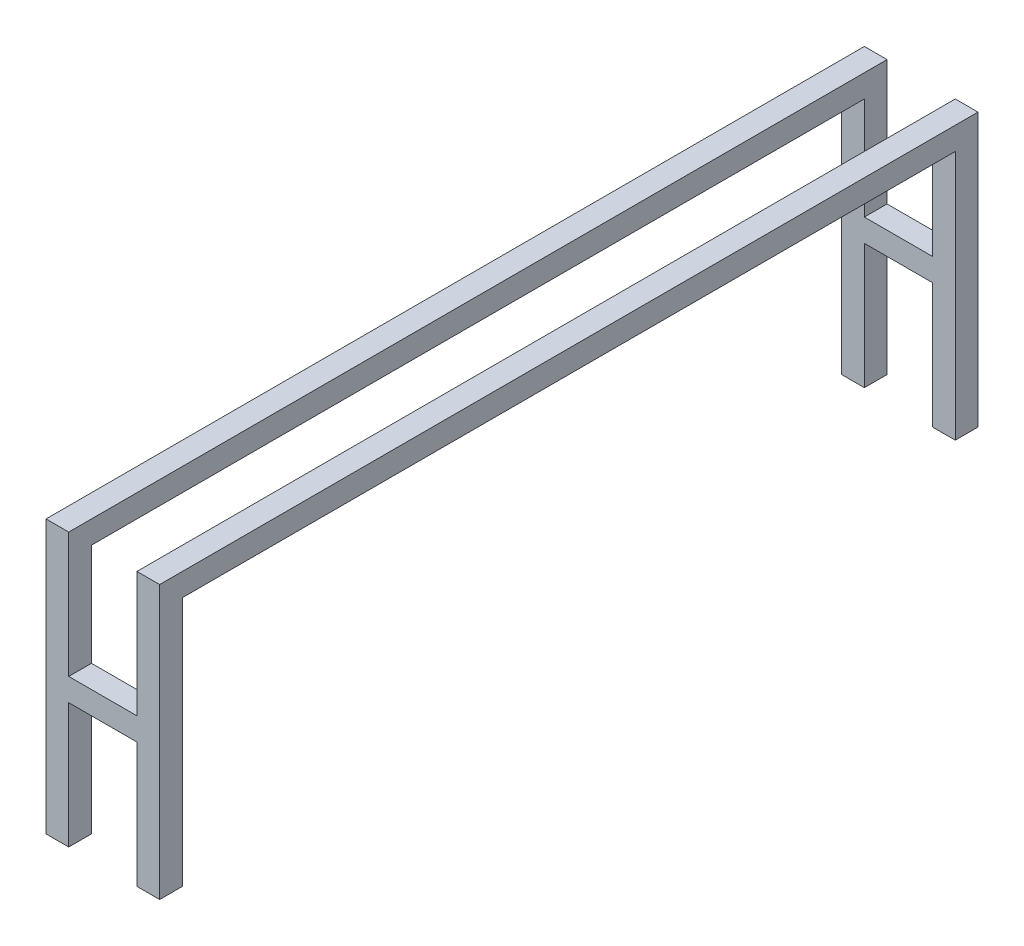
ISO-10303-21;
HEADER;
FILE_DESCRIPTION(('STEP AP214'),'2;1');
FILE_NAME('part.step','',(''),(''),'','','');
FILE_SCHEMA(('AUTOMOTIVE_DESIGN { 1 0 10303 214 1 1 1 1 }'));
ENDSEC;
DATA;
#1=APPLICATION_CONTEXT('core data for automotive mechanical design processes');
#2=APPLICATION_PROTOCOL_DEFINITION('international standard','automotive_design',2000,#1);
#3=PRODUCT_CONTEXT('',#1,'mechanical');
#4=PRODUCT('Part','Part','',(#3));
#5=PRODUCT_RELATED_PRODUCT_CATEGORY('part','',(#4));
#6=PRODUCT_DEFINITION_FORMATION('','',#4);
#7=PRODUCT_DEFINITION_CONTEXT('part definition',#1,'design');
#8=PRODUCT_DEFINITION('design','',#6,#7);
#9=PRODUCT_DEFINITION_SHAPE('','',#8);
#10=(LENGTH_UNIT() NAMED_UNIT(*) SI_UNIT(.MILLI.,.METRE.));
#11=(NAMED_UNIT(*) PLANE_ANGLE_UNIT() SI_UNIT($,.RADIAN.));
#12=(NAMED_UNIT(*) SI_UNIT($,.STERADIAN.) SOLID_ANGLE_UNIT());
#13=UNCERTAINTY_MEASURE_WITH_UNIT(LENGTH_MEASURE(1.E-05),#10,'distance_accuracy_value','');
#14=(GEOMETRIC_REPRESENTATION_CONTEXT(3) GLOBAL_UNCERTAINTY_ASSIGNED_CONTEXT((#13)) GLOBAL_UNIT_ASSIGNED_CONTEXT((#10,
#11,#12)) REPRESENTATION_CONTEXT('',''));
#15=CARTESIAN_POINT('',(0.,0.,0.));
#16=DIRECTION('',(0.,0.,1.));
#17=DIRECTION('',(1.,0.,0.));
#18=AXIS2_PLACEMENT_3D('',#15,#16,#17);
#19=CARTESIAN_POINT('',(0.,0.,0.));
#20=DIRECTION('',(1.,0.,0.));
#21=DIRECTION('',(0.,0.,-1.));
#22=AXIS2_PLACEMENT_3D('',#19,#20,#21);
#23=PLANE('',#22);
#24=DIRECTION('',(0.,0.,1.));
#25=VECTOR('',#24,1.);
#26=CARTESIAN_POINT('',(0.,275.,0.));
#27=LINE('',#26,#25);
#28=CARTESIAN_POINT('',(0.,275.,0.));
#29=VERTEX_POINT('',#28);
#30=CARTESIAN_POINT('',(0.,275.,50.));
#31=VERTEX_POINT('',#30);
#32=EDGE_CURVE('E47',#29,#31,#27,.T.);
#33=ORIENTED_EDGE('',*,*,#32,.F.);
#34=DIRECTION('',(0.,1.,0.));
#35=VECTOR('',#34,1.);
#36=CARTESIAN_POINT('',(0.,0.,0.));
#37=LINE('',#36,#35);
#38=CARTESIAN_POINT('',(0.,0.,0.));
#39=VERTEX_POINT('',#38);
#40=EDGE_CURVE('E288',#39,#29,#37,.T.);
#41=ORIENTED_EDGE('',*,*,#40,.F.);
#42=DIRECTION('',(0.,0.,-1.));
#43=VECTOR('',#42,1.);
#44=CARTESIAN_POINT('',(0.,0.,50.));
#45=LINE('',#44,#43);
#46=CARTESIAN_POINT('',(0.,0.,50.));
#47=VERTEX_POINT('',#46);
#48=EDGE_CURVE('E265',#47,#39,#45,.T.);
#49=ORIENTED_EDGE('',*,*,#48,.F.);
#50=DIRECTION('',(0.,-1.,0.));
#51=VECTOR('',#50,1.);
#52=CARTESIAN_POINT('',(0.,0.,50.));
#53=LINE('',#52,#51);
#54=EDGE_CURVE('E303',#31,#47,#53,.T.);
#55=ORIENTED_EDGE('',*,*,#54,.F.);
#56=EDGE_LOOP('',(#33,#41,#49,#55));
#57=FACE_BOUND('',#56,.T.);
#58=ADVANCED_FACE('F32',(#57),#23,.F.);
#59=DIRECTION('',(0.,0.,-1.));
#60=VECTOR('',#59,1.);
#61=CARTESIAN_POINT('',(0.,325.,0.));
#62=LINE('',#61,#60);
#63=CARTESIAN_POINT('',(0.,325.,49.9999999999998));
#64=VERTEX_POINT('',#63);
#65=CARTESIAN_POINT('',(0.,325.,0.));
#66=VERTEX_POINT('',#65);
#67=EDGE_CURVE('E220',#64,#66,#62,.T.);
#68=ORIENTED_EDGE('',*,*,#67,.F.);
#69=CARTESIAN_POINT('',(0.,550.,50.));
#70=VERTEX_POINT('',#69);
#71=EDGE_CURVE('E270',#70,#64,#53,.T.);
#72=ORIENTED_EDGE('',*,*,#71,.F.);
#73=DIRECTION('',(0.,0.,-1.));
#74=VECTOR('',#73,1.);
#75=CARTESIAN_POINT('',(0.,550.,50.));
#76=LINE('',#75,#74);
#77=CARTESIAN_POINT('',(0.,550.,1750.));
#78=VERTEX_POINT('',#77);
#79=EDGE_CURVE('E301',#78,#70,#76,.T.);
#80=ORIENTED_EDGE('',*,*,#79,.F.);
#81=DIRECTION('',(0.,1.,0.));
#82=VECTOR('',#81,1.);
#83=CARTESIAN_POINT('',(0.,550.,1750.));
#84=LINE('',#83,#82);
#85=CARTESIAN_POINT('',(0.,325.,1750.));
#86=VERTEX_POINT('',#85);
#87=EDGE_CURVE('E297',#86,#78,#84,.T.);
#88=ORIENTED_EDGE('',*,*,#87,.F.);
#89=DIRECTION('',(0.,0.,-1.));
#90=VECTOR('',#89,1.);
#91=CARTESIAN_POINT('',(0.,325.,1800.));
#92=LINE('',#91,#90);
#93=CARTESIAN_POINT('',(0.,325.,1800.));
#94=VERTEX_POINT('',#93);
#95=EDGE_CURVE('E242',#94,#86,#92,.T.);
#96=ORIENTED_EDGE('',*,*,#95,.F.);
#97=DIRECTION('',(0.,-1.,0.));
#98=VECTOR('',#97,1.);
#99=CARTESIAN_POINT('',(0.,600.,1800.));
#100=LINE('',#99,#98);
#101=CARTESIAN_POINT('',(0.,600.,1800.));
#102=VERTEX_POINT('',#101);
#103=EDGE_CURVE('E292',#102,#94,#100,.T.);
#104=ORIENTED_EDGE('',*,*,#103,.F.);
#105=DIRECTION('',(0.,0.,1.));
#106=VECTOR('',#105,1.);
#107=CARTESIAN_POINT('',(0.,600.,0.));
#108=LINE('',#107,#106);
#109=CARTESIAN_POINT('',(0.,600.,0.));
#110=VERTEX_POINT('',#109);
#111=EDGE_CURVE('E290',#110,#102,#108,.T.);
#112=ORIENTED_EDGE('',*,*,#111,.F.);
#113=EDGE_CURVE('E287',#66,#110,#37,.T.);
#114=ORIENTED_EDGE('',*,*,#113,.F.);
#115=EDGE_LOOP('',(#68,#72,#80,#88,#96,#104,#112,#114));
#116=FACE_BOUND('',#115,.T.);
#117=ADVANCED_FACE('F333',(#116),#23,.F.);
#118=DIRECTION('',(0.,0.,1.));
#119=VECTOR('',#118,1.);
#120=CARTESIAN_POINT('',(0.,275.,1800.));
#121=LINE('',#120,#119);
#122=CARTESIAN_POINT('',(0.,275.,1750.));
#123=VERTEX_POINT('',#122);
#124=CARTESIAN_POINT('',(0.,275.,1800.));
#125=VERTEX_POINT('',#124);
#126=EDGE_CURVE('E247',#123,#125,#121,.T.);
#127=ORIENTED_EDGE('',*,*,#126,.F.);
#128=CARTESIAN_POINT('',(0.,-3.2694367339181E-13,1750.));
#129=VERTEX_POINT('',#128);
#130=EDGE_CURVE('E298',#129,#123,#84,.T.);
#131=ORIENTED_EDGE('',*,*,#130,.F.);
#132=DIRECTION('',(0.,0.,-1.));
#133=VECTOR('',#132,1.);
#134=CARTESIAN_POINT('',(0.,-3.33066907387547E-13,1800.));
#135=LINE('',#134,#133);
#136=CARTESIAN_POINT('',(0.,-3.33066907387547E-13,1800.));
#137=VERTEX_POINT('',#136);
#138=EDGE_CURVE('E295',#137,#129,#135,.T.);
#139=ORIENTED_EDGE('',*,*,#138,.F.);
#140=EDGE_CURVE('E55',#125,#137,#100,.T.);
#141=ORIENTED_EDGE('',*,*,#140,.F.);
#142=EDGE_LOOP('',(#127,#131,#139,#141));
#143=FACE_BOUND('',#142,.T.);
#144=ADVANCED_FACE('F450',(#143),#23,.F.);
#145=CARTESIAN_POINT('',(50.,0.,50.));
#146=DIRECTION('',(0.,1.,0.));
#147=DIRECTION('',(0.,0.,1.));
#148=AXIS2_PLACEMENT_3D('',#145,#146,#147);
#149=PLANE('',#148);
#150=ORIENTED_EDGE('',*,*,#48,.T.);
#151=DIRECTION('',(-1.,0.,0.));
#152=VECTOR('',#151,1.);
#153=CARTESIAN_POINT('',(50.,0.,0.));
#154=LINE('',#153,#152);
#155=CARTESIAN_POINT('',(50.,0.,0.));
#156=VERTEX_POINT('',#155);
#157=EDGE_CURVE('E11',#156,#39,#154,.T.);
#158=ORIENTED_EDGE('',*,*,#157,.F.);
#159=DIRECTION('',(0.,0.,-1.));
#160=VECTOR('',#159,1.);
#161=CARTESIAN_POINT('',(50.,0.,50.));
#162=LINE('',#161,#160);
#163=CARTESIAN_POINT('',(50.,0.,50.));
#164=VERTEX_POINT('',#163);
#165=EDGE_CURVE('E266',#164,#156,#162,.T.);
#166=ORIENTED_EDGE('',*,*,#165,.F.);
#167=DIRECTION('',(-1.,0.,0.));
#168=VECTOR('',#167,1.);
#169=CARTESIAN_POINT('',(50.,0.,50.));
#170=LINE('',#169,#168);
#171=EDGE_CURVE('E284',#164,#47,#170,.T.);
#172=ORIENTED_EDGE('',*,*,#171,.T.);
#173=EDGE_LOOP('',(#150,#158,#166,#172));
#174=FACE_BOUND('',#173,.T.);
#175=ADVANCED_FACE('F34',(#174),#149,.F.);
#176=CARTESIAN_POINT('',(50.,0.,0.));
#177=DIRECTION('',(0.,0.,1.));
#178=DIRECTION('',(1.,0.,0.));
#179=AXIS2_PLACEMENT_3D('',#176,#177,#178);
#180=PLANE('',#179);
#181=ORIENTED_EDGE('',*,*,#40,.T.);
#182=DIRECTION('',(1.,0.,0.));
#183=VECTOR('',#182,1.);
#184=CARTESIAN_POINT('',(-150.,275.,0.));
#185=LINE('',#184,#183);
#186=CARTESIAN_POINT('',(-150.,275.,0.));
#187=VERTEX_POINT('',#186);
#188=EDGE_CURVE('E231',#187,#29,#185,.T.);
#189=ORIENTED_EDGE('',*,*,#188,.F.);
#190=DIRECTION('',(0.,-1.,0.));
#191=VECTOR('',#190,1.);
#192=CARTESIAN_POINT('',(-150.,0.,0.));
#193=LINE('',#192,#191);
#194=CARTESIAN_POINT('',(-150.,0.,0.));
#195=VERTEX_POINT('',#194);
#196=EDGE_CURVE('E217',#187,#195,#193,.T.);
#197=ORIENTED_EDGE('',*,*,#196,.T.);
#198=DIRECTION('',(1.,0.,0.));
#199=VECTOR('',#198,1.);
#200=CARTESIAN_POINT('',(-200.,0.,0.));
#201=LINE('',#200,#199);
#202=CARTESIAN_POINT('',(-200.,0.,0.));
#203=VERTEX_POINT('',#202);
#204=EDGE_CURVE('E197',#203,#195,#201,.T.);
#205=ORIENTED_EDGE('',*,*,#204,.F.);
#206=DIRECTION('',(0.,-1.,0.));
#207=VECTOR('',#206,1.);
#208=CARTESIAN_POINT('',(-200.,0.,0.));
#209=LINE('',#208,#207);
#210=CARTESIAN_POINT('',(-200.,600.,0.));
#211=VERTEX_POINT('',#210);
#212=EDGE_CURVE('E203',#211,#203,#209,.T.);
#213=ORIENTED_EDGE('',*,*,#212,.F.);
#214=DIRECTION('',(1.,0.,0.));
#215=VECTOR('',#214,1.);
#216=CARTESIAN_POINT('',(-200.,600.,0.));
#217=LINE('',#216,#215);
#218=CARTESIAN_POINT('',(-150.,600.,0.));
#219=VERTEX_POINT('',#218);
#220=EDGE_CURVE('E367',#211,#219,#217,.T.);
#221=ORIENTED_EDGE('',*,*,#220,.T.);
#222=CARTESIAN_POINT('',(-150.,325.,0.));
#223=VERTEX_POINT('',#222);
#224=EDGE_CURVE('E393',#219,#223,#193,.T.);
#225=ORIENTED_EDGE('',*,*,#224,.T.);
#226=DIRECTION('',(1.,0.,0.));
#227=VECTOR('',#226,1.);
#228=CARTESIAN_POINT('',(-150.,325.,0.));
#229=LINE('',#228,#227);
#230=EDGE_CURVE('E235',#223,#66,#229,.T.);
#231=ORIENTED_EDGE('',*,*,#230,.T.);
#232=ORIENTED_EDGE('',*,*,#113,.T.);
#233=DIRECTION('',(-1.,0.,0.));
#234=VECTOR('',#233,1.);
#235=CARTESIAN_POINT('',(50.,600.,0.));
#236=LINE('',#235,#234);
#237=CARTESIAN_POINT('',(50.,600.,0.));
#238=VERTEX_POINT('',#237);
#239=EDGE_CURVE('E40',#238,#110,#236,.T.);
#240=ORIENTED_EDGE('',*,*,#239,.F.);
#241=DIRECTION('',(0.,1.,0.));
#242=VECTOR('',#241,1.);
#243=CARTESIAN_POINT('',(50.,0.,0.));
#244=LINE('',#243,#242);
#245=EDGE_CURVE('E269',#156,#238,#244,.T.);
#246=ORIENTED_EDGE('',*,*,#245,.F.);
#247=ORIENTED_EDGE('',*,*,#157,.T.);
#248=EDGE_LOOP('',(#181,#189,#197,#205,#213,#221,#225,#231,#232,#240,#246,#247));
#249=FACE_BOUND('',#248,.T.);
#250=ADVANCED_FACE('F215',(#249),#180,.F.);
#251=CARTESIAN_POINT('',(50.,600.,0.));
#252=DIRECTION('',(0.,-1.,0.));
#253=DIRECTION('',(0.,0.,-1.));
#254=AXIS2_PLACEMENT_3D('',#251,#252,#253);
#255=PLANE('',#254);
#256=ORIENTED_EDGE('',*,*,#111,.T.);
#257=DIRECTION('',(-1.,0.,0.));
#258=VECTOR('',#257,1.);
#259=CARTESIAN_POINT('',(50.,600.,1800.));
#260=LINE('',#259,#258);
#261=CARTESIAN_POINT('',(50.,600.,1800.));
#262=VERTEX_POINT('',#261);
#263=EDGE_CURVE('E320',#262,#102,#260,.T.);
#264=ORIENTED_EDGE('',*,*,#263,.F.);
#265=DIRECTION('',(0.,0.,1.));
#266=VECTOR('',#265,1.);
#267=CARTESIAN_POINT('',(50.,600.,0.));
#268=LINE('',#267,#266);
#269=EDGE_CURVE('E272',#238,#262,#268,.T.);
#270=ORIENTED_EDGE('',*,*,#269,.F.);
#271=ORIENTED_EDGE('',*,*,#239,.T.);
#272=EDGE_LOOP('',(#256,#264,#270,#271));
#273=FACE_BOUND('',#272,.T.);
#274=ADVANCED_FACE('F327',(#273),#255,.F.);
#275=CARTESIAN_POINT('',(50.,600.,1800.));
#276=DIRECTION('',(0.,0.,-1.));
#277=DIRECTION('',(0.,1.,0.));
#278=AXIS2_PLACEMENT_3D('',#275,#276,#277);
#279=PLANE('',#278);
#280=ORIENTED_EDGE('',*,*,#103,.T.);
#281=DIRECTION('',(1.,0.,0.));
#282=VECTOR('',#281,1.);
#283=CARTESIAN_POINT('',(-150.,325.,1800.));
#284=LINE('',#283,#282);
#285=CARTESIAN_POINT('',(-150.,325.,1800.));
#286=VERTEX_POINT('',#285);
#287=EDGE_CURVE('E262',#286,#94,#284,.T.);
#288=ORIENTED_EDGE('',*,*,#287,.F.);
#289=DIRECTION('',(0.,1.,0.));
#290=VECTOR('',#289,1.);
#291=CARTESIAN_POINT('',(-150.,0.,1800.));
#292=LINE('',#291,#290);
#293=CARTESIAN_POINT('',(-150.,600.,1800.));
#294=VERTEX_POINT('',#293);
#295=EDGE_CURVE('E348',#286,#294,#292,.T.);
#296=ORIENTED_EDGE('',*,*,#295,.T.);
#297=DIRECTION('',(1.,0.,0.));
#298=VECTOR('',#297,1.);
#299=CARTESIAN_POINT('',(-200.,600.,1800.));
#300=LINE('',#299,#298);
#301=CARTESIAN_POINT('',(-200.,600.,1800.));
#302=VERTEX_POINT('',#301);
#303=EDGE_CURVE('E369',#302,#294,#300,.T.);
#304=ORIENTED_EDGE('',*,*,#303,.F.);
#305=DIRECTION('',(0.,1.,0.));
#306=VECTOR('',#305,1.);
#307=CARTESIAN_POINT('',(-200.,0.,1800.));
#308=LINE('',#307,#306);
#309=CARTESIAN_POINT('',(-200.,0.,1800.));
#310=VERTEX_POINT('',#309);
#311=EDGE_CURVE('E397',#310,#302,#308,.T.);
#312=ORIENTED_EDGE('',*,*,#311,.F.);
#313=DIRECTION('',(1.,0.,0.));
#314=VECTOR('',#313,1.);
#315=CARTESIAN_POINT('',(-200.,0.,1800.));
#316=LINE('',#315,#314);
#317=CARTESIAN_POINT('',(-150.,0.,1800.));
#318=VERTEX_POINT('',#317);
#319=EDGE_CURVE('E372',#310,#318,#316,.T.);
#320=ORIENTED_EDGE('',*,*,#319,.T.);
#321=CARTESIAN_POINT('',(-150.,275.,1800.));
#322=VERTEX_POINT('',#321);
#323=EDGE_CURVE('E363',#318,#322,#292,.T.);
#324=ORIENTED_EDGE('',*,*,#323,.T.);
#325=DIRECTION('',(1.,0.,0.));
#326=VECTOR('',#325,1.);
#327=CARTESIAN_POINT('',(-150.,275.,1800.));
#328=LINE('',#327,#326);
#329=EDGE_CURVE('E250',#322,#125,#328,.T.);
#330=ORIENTED_EDGE('',*,*,#329,.T.);
#331=ORIENTED_EDGE('',*,*,#140,.T.);
#332=DIRECTION('',(-1.,0.,0.));
#333=VECTOR('',#332,1.);
#334=CARTESIAN_POINT('',(50.,-3.33066907387547E-13,1800.));
#335=LINE('',#334,#333);
#336=CARTESIAN_POINT('',(50.,-3.33066907387547E-13,1800.));
#337=VERTEX_POINT('',#336);
#338=EDGE_CURVE('E317',#337,#137,#335,.T.);
#339=ORIENTED_EDGE('',*,*,#338,.F.);
#340=DIRECTION('',(0.,-1.,0.));
#341=VECTOR('',#340,1.);
#342=CARTESIAN_POINT('',(50.,600.,1800.));
#343=LINE('',#342,#341);
#344=EDGE_CURVE('E274',#262,#337,#343,.T.);
#345=ORIENTED_EDGE('',*,*,#344,.F.);
#346=ORIENTED_EDGE('',*,*,#263,.T.);
#347=EDGE_LOOP('',(#280,#288,#296,#304,#312,#320,#324,#330,#331,#339,#345,#346));
#348=FACE_BOUND('',#347,.T.);
#349=ADVANCED_FACE('F336',(#348),#279,.F.);
#350=CARTESIAN_POINT('',(50.,-3.33066907387547E-13,1800.));
#351=DIRECTION('',(0.,1.,0.));
#352=DIRECTION('',(0.,0.,1.));
#353=AXIS2_PLACEMENT_3D('',#350,#351,#352);
#354=PLANE('',#353);
#355=ORIENTED_EDGE('',*,*,#138,.T.);
#356=DIRECTION('',(-1.,0.,0.));
#357=VECTOR('',#356,1.);
#358=CARTESIAN_POINT('',(50.,-3.2694367339181E-13,1750.));
#359=LINE('',#358,#357);
#360=CARTESIAN_POINT('',(50.,-3.2694367339181E-13,1750.));
#361=VERTEX_POINT('',#360);
#362=EDGE_CURVE('E314',#361,#129,#359,.T.);
#363=ORIENTED_EDGE('',*,*,#362,.F.);
#364=DIRECTION('',(0.,0.,-1.));
#365=VECTOR('',#364,1.);
#366=CARTESIAN_POINT('',(50.,-3.33066907387547E-13,1800.));
#367=LINE('',#366,#365);
#368=EDGE_CURVE('E276',#337,#361,#367,.T.);
#369=ORIENTED_EDGE('',*,*,#368,.F.);
#370=ORIENTED_EDGE('',*,*,#338,.T.);
#371=EDGE_LOOP('',(#355,#363,#369,#370));
#372=FACE_BOUND('',#371,.T.);
#373=ADVANCED_FACE('F454',(#372),#354,.F.);
#374=CARTESIAN_POINT('',(50.,550.,1750.));
#375=DIRECTION('',(0.,0.,1.));
#376=DIRECTION('',(1.,0.,0.));
#377=AXIS2_PLACEMENT_3D('',#374,#375,#376);
#378=PLANE('',#377);
#379=ORIENTED_EDGE('',*,*,#130,.T.);
#380=DIRECTION('',(1.,0.,0.));
#381=VECTOR('',#380,1.);
#382=CARTESIAN_POINT('',(-150.,275.,1750.));
#383=LINE('',#382,#381);
#384=CARTESIAN_POINT('',(-150.,275.,1750.));
#385=VERTEX_POINT('',#384);
#386=EDGE_CURVE('E256',#385,#123,#383,.T.);
#387=ORIENTED_EDGE('',*,*,#386,.F.);
#388=DIRECTION('',(0.,-1.,0.));
#389=VECTOR('',#388,1.);
#390=CARTESIAN_POINT('',(-150.,0.,1750.));
#391=LINE('',#390,#389);
#392=CARTESIAN_POINT('',(-150.,0.,1750.));
#393=VERTEX_POINT('',#392);
#394=EDGE_CURVE('E356',#385,#393,#391,.T.);
#395=ORIENTED_EDGE('',*,*,#394,.T.);
#396=DIRECTION('',(1.,0.,0.));
#397=VECTOR('',#396,1.);
#398=CARTESIAN_POINT('',(-200.,0.,1750.));
#399=LINE('',#398,#397);
#400=CARTESIAN_POINT('',(-200.,0.,1750.));
#401=VERTEX_POINT('',#400);
#402=EDGE_CURVE('E375',#401,#393,#399,.T.);
#403=ORIENTED_EDGE('',*,*,#402,.F.);
#404=DIRECTION('',(0.,-1.,0.));
#405=VECTOR('',#404,1.);
#406=CARTESIAN_POINT('',(-200.,0.,1750.));
#407=LINE('',#406,#405);
#408=CARTESIAN_POINT('',(-200.,550.,1750.));
#409=VERTEX_POINT('',#408);
#410=EDGE_CURVE('E401',#409,#401,#407,.T.);
#411=ORIENTED_EDGE('',*,*,#410,.F.);
#412=DIRECTION('',(1.,0.,0.));
#413=VECTOR('',#412,1.);
#414=CARTESIAN_POINT('',(-200.,550.,1750.));
#415=LINE('',#414,#413);
#416=CARTESIAN_POINT('',(-150.,550.,1750.));
#417=VERTEX_POINT('',#416);
#418=EDGE_CURVE('E354',#409,#417,#415,.T.);
#419=ORIENTED_EDGE('',*,*,#418,.T.);
#420=CARTESIAN_POINT('',(-150.,325.,1750.));
#421=VERTEX_POINT('',#420);
#422=EDGE_CURVE('E346',#417,#421,#391,.T.);
#423=ORIENTED_EDGE('',*,*,#422,.T.);
#424=DIRECTION('',(1.,0.,0.));
#425=VECTOR('',#424,1.);
#426=CARTESIAN_POINT('',(-150.,325.,1750.));
#427=LINE('',#426,#425);
#428=EDGE_CURVE('E259',#421,#86,#427,.T.);
#429=ORIENTED_EDGE('',*,*,#428,.T.);
#430=ORIENTED_EDGE('',*,*,#87,.T.);
#431=DIRECTION('',(-1.,0.,0.));
#432=VECTOR('',#431,1.);
#433=CARTESIAN_POINT('',(50.,550.,1750.));
#434=LINE('',#433,#432);
#435=CARTESIAN_POINT('',(50.,550.,1750.));
#436=VERTEX_POINT('',#435);
#437=EDGE_CURVE('E311',#436,#78,#434,.T.);
#438=ORIENTED_EDGE('',*,*,#437,.F.);
#439=DIRECTION('',(0.,1.,0.));
#440=VECTOR('',#439,1.);
#441=CARTESIAN_POINT('',(50.,550.,1750.));
#442=LINE('',#441,#440);
#443=EDGE_CURVE('E278',#361,#436,#442,.T.);
#444=ORIENTED_EDGE('',*,*,#443,.F.);
#445=ORIENTED_EDGE('',*,*,#362,.T.);
#446=EDGE_LOOP('',(#379,#387,#395,#403,#411,#419,#423,#429,#430,#438,#444,#445));
#447=FACE_BOUND('',#446,.T.);
#448=ADVANCED_FACE('F351',(#447),#378,.F.);
#449=CARTESIAN_POINT('',(50.,550.,50.));
#450=DIRECTION('',(0.,1.,0.));
#451=DIRECTION('',(0.,0.,1.));
#452=AXIS2_PLACEMENT_3D('',#449,#450,#451);
#453=PLANE('',#452);
#454=ORIENTED_EDGE('',*,*,#79,.T.);
#455=DIRECTION('',(-1.,0.,0.));
#456=VECTOR('',#455,1.);
#457=CARTESIAN_POINT('',(50.,550.,50.));
#458=LINE('',#457,#456);
#459=CARTESIAN_POINT('',(50.,550.,50.));
#460=VERTEX_POINT('',#459);
#461=EDGE_CURVE('E308',#460,#70,#458,.T.);
#462=ORIENTED_EDGE('',*,*,#461,.F.);
#463=DIRECTION('',(0.,0.,-1.));
#464=VECTOR('',#463,1.);
#465=CARTESIAN_POINT('',(50.,550.,50.));
#466=LINE('',#465,#464);
#467=EDGE_CURVE('E280',#436,#460,#466,.T.);
#468=ORIENTED_EDGE('',*,*,#467,.F.);
#469=ORIENTED_EDGE('',*,*,#437,.T.);
#470=EDGE_LOOP('',(#454,#462,#468,#469));
#471=FACE_BOUND('',#470,.T.);
#472=ADVANCED_FACE('F425',(#471),#453,.F.);
#473=CARTESIAN_POINT('',(50.,0.,50.));
#474=DIRECTION('',(0.,0.,-1.));
#475=DIRECTION('',(-1.,0.,0.));
#476=AXIS2_PLACEMENT_3D('',#473,#474,#475);
#477=PLANE('',#476);
#478=ORIENTED_EDGE('',*,*,#71,.T.);
#479=DIRECTION('',(1.,0.,0.));
#480=VECTOR('',#479,1.);
#481=CARTESIAN_POINT('',(-150.,325.,49.9999999999998));
#482=LINE('',#481,#480);
#483=CARTESIAN_POINT('',(-150.,325.,49.9999999999998));
#484=VERTEX_POINT('',#483);
#485=EDGE_CURVE('E238',#484,#64,#482,.T.);
#486=ORIENTED_EDGE('',*,*,#485,.F.);
#487=DIRECTION('',(0.,1.,0.));
#488=VECTOR('',#487,1.);
#489=CARTESIAN_POINT('',(-150.,0.,50.));
#490=LINE('',#489,#488);
#491=CARTESIAN_POINT('',(-150.,550.,50.));
#492=VERTEX_POINT('',#491);
#493=EDGE_CURVE('E386',#484,#492,#490,.T.);
#494=ORIENTED_EDGE('',*,*,#493,.T.);
#495=DIRECTION('',(1.,0.,0.));
#496=VECTOR('',#495,1.);
#497=CARTESIAN_POINT('',(-200.,550.,50.));
#498=LINE('',#497,#496);
#499=CARTESIAN_POINT('',(-200.,550.,50.));
#500=VERTEX_POINT('',#499);
#501=EDGE_CURVE('E222',#500,#492,#498,.T.);
#502=ORIENTED_EDGE('',*,*,#501,.F.);
#503=DIRECTION('',(0.,1.,0.));
#504=VECTOR('',#503,1.);
#505=CARTESIAN_POINT('',(-200.,0.,50.));
#506=LINE('',#505,#504);
#507=CARTESIAN_POINT('',(-200.,0.,50.));
#508=VERTEX_POINT('',#507);
#509=EDGE_CURVE('E202',#508,#500,#506,.T.);
#510=ORIENTED_EDGE('',*,*,#509,.F.);
#511=DIRECTION('',(1.,0.,0.));
#512=VECTOR('',#511,1.);
#513=CARTESIAN_POINT('',(-200.,0.,50.));
#514=LINE('',#513,#512);
#515=CARTESIAN_POINT('',(-150.,0.,50.));
#516=VERTEX_POINT('',#515);
#517=EDGE_CURVE('E199',#508,#516,#514,.T.);
#518=ORIENTED_EDGE('',*,*,#517,.T.);
#519=CARTESIAN_POINT('',(-150.,275.,49.9999999999998));
#520=VERTEX_POINT('',#519);
#521=EDGE_CURVE('E387',#516,#520,#490,.T.);
#522=ORIENTED_EDGE('',*,*,#521,.T.);
#523=DIRECTION('',(1.,0.,0.));
#524=VECTOR('',#523,1.);
#525=CARTESIAN_POINT('',(-150.,275.,49.9999999999998));
#526=LINE('',#525,#524);
#527=EDGE_CURVE('E240',#520,#31,#526,.T.);
#528=ORIENTED_EDGE('',*,*,#527,.T.);
#529=ORIENTED_EDGE('',*,*,#54,.T.);
#530=ORIENTED_EDGE('',*,*,#171,.F.);
#531=DIRECTION('',(0.,-1.,0.));
#532=VECTOR('',#531,1.);
#533=CARTESIAN_POINT('',(50.,0.,50.));
#534=LINE('',#533,#532);
#535=EDGE_CURVE('E282',#460,#164,#534,.T.);
#536=ORIENTED_EDGE('',*,*,#535,.F.);
#537=ORIENTED_EDGE('',*,*,#461,.T.);
#538=EDGE_LOOP('',(#478,#486,#494,#502,#510,#518,#522,#528,#529,#530,#536,#537));
#539=FACE_BOUND('',#538,.T.);
#540=ADVANCED_FACE('F404',(#539),#477,.F.);
#541=CARTESIAN_POINT('',(50.,0.,0.));
#542=DIRECTION('',(1.,0.,0.));
#543=DIRECTION('',(0.,0.,-1.));
#544=AXIS2_PLACEMENT_3D('',#541,#542,#543);
#545=PLANE('',#544);
#546=ORIENTED_EDGE('',*,*,#165,.T.);
#547=ORIENTED_EDGE('',*,*,#245,.T.);
#548=ORIENTED_EDGE('',*,*,#269,.T.);
#549=ORIENTED_EDGE('',*,*,#344,.T.);
#550=ORIENTED_EDGE('',*,*,#368,.T.);
#551=ORIENTED_EDGE('',*,*,#443,.T.);
#552=ORIENTED_EDGE('',*,*,#467,.T.);
#553=ORIENTED_EDGE('',*,*,#535,.T.);
#554=EDGE_LOOP('',(#546,#547,#548,#549,#550,#551,#552,#553));
#555=FACE_BOUND('',#554,.T.);
#556=ADVANCED_FACE('F420',(#555),#545,.T.);
#557=CARTESIAN_POINT('',(-150.,325.,1800.));
#558=DIRECTION('',(0.,-1.,0.));
#559=DIRECTION('',(0.,0.,-1.));
#560=AXIS2_PLACEMENT_3D('',#557,#558,#559);
#561=PLANE('',#560);
#562=ORIENTED_EDGE('',*,*,#95,.T.);
#563=ORIENTED_EDGE('',*,*,#428,.F.);
#564=DIRECTION('',(0.,0.,-1.));
#565=VECTOR('',#564,1.);
#566=CARTESIAN_POINT('',(-150.,325.,1800.));
#567=LINE('',#566,#565);
#568=EDGE_CURVE('E243',#286,#421,#567,.T.);
#569=ORIENTED_EDGE('',*,*,#568,.F.);
#570=ORIENTED_EDGE('',*,*,#287,.T.);
#571=EDGE_LOOP('',(#562,#563,#569,#570));
#572=FACE_BOUND('',#571,.T.);
#573=ADVANCED_FACE('F340',(#572),#561,.F.);
#574=CARTESIAN_POINT('',(-150.,275.,1800.));
#575=DIRECTION('',(0.,1.,0.));
#576=DIRECTION('',(0.,0.,1.));
#577=AXIS2_PLACEMENT_3D('',#574,#575,#576);
#578=PLANE('',#577);
#579=ORIENTED_EDGE('',*,*,#126,.T.);
#580=ORIENTED_EDGE('',*,*,#329,.F.);
#581=DIRECTION('',(0.,0.,1.));
#582=VECTOR('',#581,1.);
#583=CARTESIAN_POINT('',(-150.,275.,1800.));
#584=LINE('',#583,#582);
#585=EDGE_CURVE('E246',#385,#322,#584,.T.);
#586=ORIENTED_EDGE('',*,*,#585,.F.);
#587=ORIENTED_EDGE('',*,*,#386,.T.);
#588=EDGE_LOOP('',(#579,#580,#586,#587));
#589=FACE_BOUND('',#588,.T.);
#590=ADVANCED_FACE('F448',(#589),#578,.F.);
#591=CARTESIAN_POINT('',(-150.,275.,0.));
#592=DIRECTION('',(0.,1.,0.));
#593=DIRECTION('',(0.,0.,1.));
#594=AXIS2_PLACEMENT_3D('',#591,#592,#593);
#595=PLANE('',#594);
#596=ORIENTED_EDGE('',*,*,#32,.T.);
#597=ORIENTED_EDGE('',*,*,#527,.F.);
#598=DIRECTION('',(0.,0.,1.));
#599=VECTOR('',#598,1.);
#600=CARTESIAN_POINT('',(-150.,275.,0.));
#601=LINE('',#600,#599);
#602=EDGE_CURVE('E226',#187,#520,#601,.T.);
#603=ORIENTED_EDGE('',*,*,#602,.F.);
#604=ORIENTED_EDGE('',*,*,#188,.T.);
#605=EDGE_LOOP('',(#596,#597,#603,#604));
#606=FACE_BOUND('',#605,.T.);
#607=ADVANCED_FACE('F408',(#606),#595,.F.);
#608=CARTESIAN_POINT('',(-150.,325.,0.));
#609=DIRECTION('',(0.,-1.,0.));
#610=DIRECTION('',(0.,0.,-1.));
#611=AXIS2_PLACEMENT_3D('',#608,#609,#610);
#612=PLANE('',#611);
#613=ORIENTED_EDGE('',*,*,#67,.T.);
#614=ORIENTED_EDGE('',*,*,#230,.F.);
#615=DIRECTION('',(0.,0.,-1.));
#616=VECTOR('',#615,1.);
#617=CARTESIAN_POINT('',(-150.,325.,0.));
#618=LINE('',#617,#616);
#619=EDGE_CURVE('E229',#484,#223,#618,.T.);
#620=ORIENTED_EDGE('',*,*,#619,.F.);
#621=ORIENTED_EDGE('',*,*,#485,.T.);
#622=EDGE_LOOP('',(#613,#614,#620,#621));
#623=FACE_BOUND('',#622,.T.);
#624=ADVANCED_FACE('F429',(#623),#612,.F.);
#625=CARTESIAN_POINT('',(-150.,0.,0.));
#626=DIRECTION('',(1.,0.,0.));
#627=DIRECTION('',(0.,0.,-1.));
#628=AXIS2_PLACEMENT_3D('',#625,#626,#627);
#629=PLANE('',#628);
#630=ORIENTED_EDGE('',*,*,#295,.F.);
#631=ORIENTED_EDGE('',*,*,#568,.T.);
#632=ORIENTED_EDGE('',*,*,#422,.F.);
#633=DIRECTION('',(0.,0.,1.));
#634=VECTOR('',#633,1.);
#635=CARTESIAN_POINT('',(-150.,550.,50.));
#636=LINE('',#635,#634);
#637=EDGE_CURVE('E359',#492,#417,#636,.T.);
#638=ORIENTED_EDGE('',*,*,#637,.F.);
#639=ORIENTED_EDGE('',*,*,#493,.F.);
#640=ORIENTED_EDGE('',*,*,#619,.T.);
#641=ORIENTED_EDGE('',*,*,#224,.F.);
#642=DIRECTION('',(0.,0.,-1.));
#643=VECTOR('',#642,1.);
#644=CARTESIAN_POINT('',(-150.,600.,0.));
#645=LINE('',#644,#643);
#646=EDGE_CURVE('E212',#294,#219,#645,.T.);
#647=ORIENTED_EDGE('',*,*,#646,.F.);
#648=EDGE_LOOP('',(#630,#631,#632,#638,#639,#640,#641,#647));
#649=FACE_BOUND('',#648,.T.);
#650=ADVANCED_FACE('F344',(#649),#629,.T.);
#651=ORIENTED_EDGE('',*,*,#196,.F.);
#652=ORIENTED_EDGE('',*,*,#602,.T.);
#653=ORIENTED_EDGE('',*,*,#521,.F.);
#654=DIRECTION('',(0.,0.,1.));
#655=VECTOR('',#654,1.);
#656=CARTESIAN_POINT('',(-150.,0.,0.));
#657=LINE('',#656,#655);
#658=EDGE_CURVE('E390',#195,#516,#657,.T.);
#659=ORIENTED_EDGE('',*,*,#658,.F.);
#660=EDGE_LOOP('',(#651,#652,#653,#659));
#661=FACE_BOUND('',#660,.T.);
#662=ADVANCED_FACE('F406',(#661),#629,.T.);
#663=CARTESIAN_POINT('',(-200.,0.,0.));
#664=DIRECTION('',(0.,1.,0.));
#665=DIRECTION('',(0.,0.,1.));
#666=AXIS2_PLACEMENT_3D('',#663,#664,#665);
#667=PLANE('',#666);
#668=ORIENTED_EDGE('',*,*,#658,.T.);
#669=ORIENTED_EDGE('',*,*,#517,.F.);
#670=DIRECTION('',(0.,0.,1.));
#671=VECTOR('',#670,1.);
#672=CARTESIAN_POINT('',(-200.,0.,0.));
#673=LINE('',#672,#671);
#674=EDGE_CURVE('E193',#203,#508,#673,.T.);
#675=ORIENTED_EDGE('',*,*,#674,.F.);
#676=ORIENTED_EDGE('',*,*,#204,.T.);
#677=EDGE_LOOP('',(#668,#669,#675,#676));
#678=FACE_BOUND('',#677,.T.);
#679=ADVANCED_FACE('F195',(#678),#667,.F.);
#680=CARTESIAN_POINT('',(-200.,550.,50.));
#681=DIRECTION('',(0.,1.,0.));
#682=DIRECTION('',(0.,0.,1.));
#683=AXIS2_PLACEMENT_3D('',#680,#681,#682);
#684=PLANE('',#683);
#685=ORIENTED_EDGE('',*,*,#637,.T.);
#686=ORIENTED_EDGE('',*,*,#418,.F.);
#687=DIRECTION('',(0.,0.,1.));
#688=VECTOR('',#687,1.);
#689=CARTESIAN_POINT('',(-200.,550.,50.));
#690=LINE('',#689,#688);
#691=EDGE_CURVE('E383',#500,#409,#690,.T.);
#692=ORIENTED_EDGE('',*,*,#691,.F.);
#693=ORIENTED_EDGE('',*,*,#501,.T.);
#694=EDGE_LOOP('',(#685,#686,#692,#693));
#695=FACE_BOUND('',#694,.T.);
#696=ADVANCED_FACE('F382',(#695),#684,.F.);
#697=CARTESIAN_POINT('',(-200.,0.,1750.));
#698=DIRECTION('',(0.,1.,0.));
#699=DIRECTION('',(0.,0.,1.));
#700=AXIS2_PLACEMENT_3D('',#697,#698,#699);
#701=PLANE('',#700);
#702=DIRECTION('',(0.,0.,1.));
#703=VECTOR('',#702,1.);
#704=CARTESIAN_POINT('',(-150.,0.,1750.));
#705=LINE('',#704,#703);
#706=EDGE_CURVE('E355',#393,#318,#705,.T.);
#707=ORIENTED_EDGE('',*,*,#706,.T.);
#708=ORIENTED_EDGE('',*,*,#319,.F.);
#709=DIRECTION('',(0.,0.,1.));
#710=VECTOR('',#709,1.);
#711=CARTESIAN_POINT('',(-200.,0.,1750.));
#712=LINE('',#711,#710);
#713=EDGE_CURVE('E399',#401,#310,#712,.T.);
#714=ORIENTED_EDGE('',*,*,#713,.F.);
#715=ORIENTED_EDGE('',*,*,#402,.T.);
#716=EDGE_LOOP('',(#707,#708,#714,#715));
#717=FACE_BOUND('',#716,.T.);
#718=ADVANCED_FACE('F440',(#717),#701,.F.);
#719=CARTESIAN_POINT('',(-200.,600.,0.));
#720=DIRECTION('',(0.,-1.,0.));
#721=DIRECTION('',(0.,0.,-1.));
#722=AXIS2_PLACEMENT_3D('',#719,#720,#721);
#723=PLANE('',#722);
#724=ORIENTED_EDGE('',*,*,#646,.T.);
#725=ORIENTED_EDGE('',*,*,#220,.F.);
#726=DIRECTION('',(0.,0.,-1.));
#727=VECTOR('',#726,1.);
#728=CARTESIAN_POINT('',(-200.,600.,0.));
#729=LINE('',#728,#727);
#730=EDGE_CURVE('E208',#302,#211,#729,.T.);
#731=ORIENTED_EDGE('',*,*,#730,.F.);
#732=ORIENTED_EDGE('',*,*,#303,.T.);
#733=EDGE_LOOP('',(#724,#725,#731,#732));
#734=FACE_BOUND('',#733,.T.);
#735=ADVANCED_FACE('F432',(#734),#723,.F.);
#736=CARTESIAN_POINT('',(-200.,0.,0.));
#737=DIRECTION('',(1.,0.,0.));
#738=DIRECTION('',(0.,0.,-1.));
#739=AXIS2_PLACEMENT_3D('',#736,#737,#738);
#740=PLANE('',#739);
#741=ORIENTED_EDGE('',*,*,#212,.T.);
#742=ORIENTED_EDGE('',*,*,#674,.T.);
#743=ORIENTED_EDGE('',*,*,#509,.T.);
#744=ORIENTED_EDGE('',*,*,#691,.T.);
#745=ORIENTED_EDGE('',*,*,#410,.T.);
#746=ORIENTED_EDGE('',*,*,#713,.T.);
#747=ORIENTED_EDGE('',*,*,#311,.T.);
#748=ORIENTED_EDGE('',*,*,#730,.T.);
#749=EDGE_LOOP('',(#741,#742,#743,#744,#745,#746,#747,#748));
#750=FACE_BOUND('',#749,.T.);
#751=ADVANCED_FACE('F206',(#750),#740,.F.);
#752=ORIENTED_EDGE('',*,*,#394,.F.);
#753=ORIENTED_EDGE('',*,*,#585,.T.);
#754=ORIENTED_EDGE('',*,*,#323,.F.);
#755=ORIENTED_EDGE('',*,*,#706,.F.);
#756=EDGE_LOOP('',(#752,#753,#754,#755));
#757=FACE_BOUND('',#756,.T.);
#758=ADVANCED_FACE('F444',(#757),#629,.T.);
#759=CLOSED_SHELL('',(#58,#117,#144,#175,#250,#274,#349,#373,#448,#472,#540,#556,#573,#590,#607,
#624,#650,#662,#679,#696,#718,#735,#751,#758));
#760=MANIFOLD_SOLID_BREP('B2',#759);
#761=ADVANCED_BREP_SHAPE_REPRESENTATION('',(#18,#760),#14);
#762=SHAPE_DEFINITION_REPRESENTATION(#9,#761);
ENDSEC;
END-ISO-10303-21;
